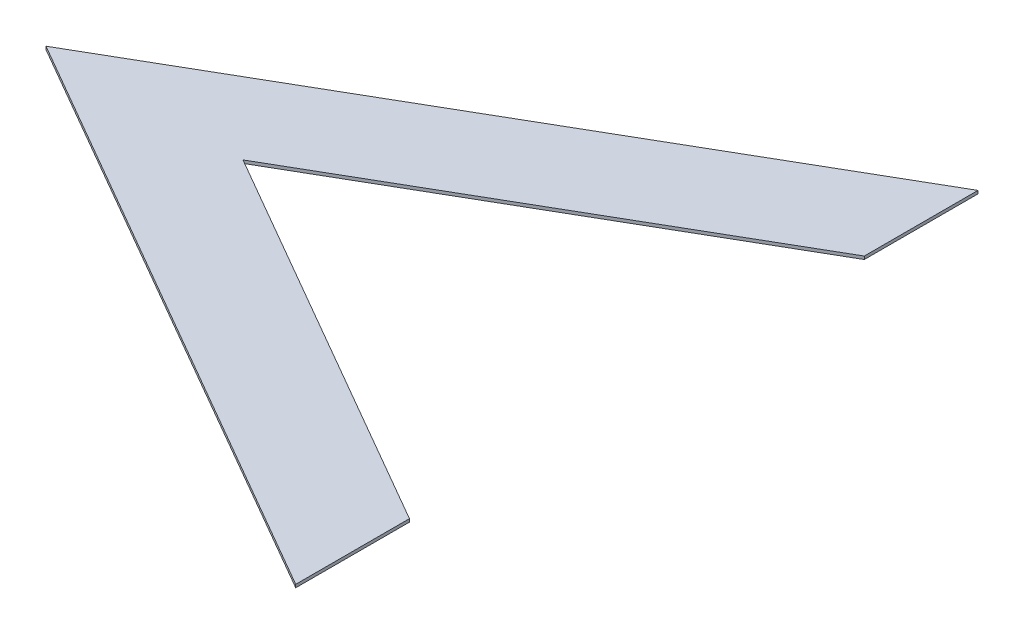
ISO-10303-21;
HEADER;
FILE_DESCRIPTION(('STEP AP214'),'2;1');
FILE_NAME('part.step','',(''),(''),'','','');
FILE_SCHEMA(('AUTOMOTIVE_DESIGN { 1 0 10303 214 1 1 1 1 }'));
ENDSEC;
DATA;
#1=APPLICATION_CONTEXT('core data for automotive mechanical design processes');
#2=APPLICATION_PROTOCOL_DEFINITION('international standard','automotive_design',2000,#1);
#3=PRODUCT_CONTEXT('',#1,'mechanical');
#4=PRODUCT('Part','Part','',(#3));
#5=PRODUCT_RELATED_PRODUCT_CATEGORY('part','',(#4));
#6=PRODUCT_DEFINITION_FORMATION('','',#4);
#7=PRODUCT_DEFINITION_CONTEXT('part definition',#1,'design');
#8=PRODUCT_DEFINITION('design','',#6,#7);
#9=PRODUCT_DEFINITION_SHAPE('','',#8);
#10=(LENGTH_UNIT() NAMED_UNIT(*) SI_UNIT(.MILLI.,.METRE.));
#11=(NAMED_UNIT(*) PLANE_ANGLE_UNIT() SI_UNIT($,.RADIAN.));
#12=(NAMED_UNIT(*) SI_UNIT($,.STERADIAN.) SOLID_ANGLE_UNIT());
#13=UNCERTAINTY_MEASURE_WITH_UNIT(LENGTH_MEASURE(1.E-05),#10,'distance_accuracy_value','');
#14=(GEOMETRIC_REPRESENTATION_CONTEXT(3) GLOBAL_UNCERTAINTY_ASSIGNED_CONTEXT((#13)) GLOBAL_UNIT_ASSIGNED_CONTEXT((#10,
#11,#12)) REPRESENTATION_CONTEXT('',''));
#15=CARTESIAN_POINT('',(0.,0.,0.));
#16=DIRECTION('',(0.,0.,1.));
#17=DIRECTION('',(1.,0.,0.));
#18=AXIS2_PLACEMENT_3D('',#15,#16,#17);
#19=CARTESIAN_POINT('',(34.5602065875376,71.3728759217129,85.6019747302543));
#20=DIRECTION('',(-1.,0.,0.));
#21=DIRECTION('',(0.,0.,1.));
#22=AXIS2_PLACEMENT_3D('',#19,#20,#21);
#23=PLANE('',#22);
#24=DIRECTION('',(0.,0.,-1.));
#25=VECTOR('',#24,1.);
#26=CARTESIAN_POINT('',(34.5602065875376,71.1228759217129,85.6019747302543));
#27=LINE('',#26,#25);
#28=CARTESIAN_POINT('',(34.5602065875376,71.1228759217129,85.6019747302543));
#29=VERTEX_POINT('',#28);
#30=CARTESIAN_POINT('',(34.5602065875376,71.122875921713,76.268641396921));
#31=VERTEX_POINT('',#30);
#32=EDGE_CURVE('E119',#29,#31,#27,.T.);
#33=ORIENTED_EDGE('',*,*,#32,.T.);
#34=DIRECTION('',(0.,-1.,0.));
#35=VECTOR('',#34,1.);
#36=CARTESIAN_POINT('',(34.5602065875376,71.372875921713,76.268641396921));
#37=LINE('',#36,#35);
#38=CARTESIAN_POINT('',(34.5602065875376,71.372875921713,76.268641396921));
#39=VERTEX_POINT('',#38);
#40=EDGE_CURVE('E11',#39,#31,#37,.T.);
#41=ORIENTED_EDGE('',*,*,#40,.F.);
#42=DIRECTION('',(0.,0.,-1.));
#43=VECTOR('',#42,1.);
#44=CARTESIAN_POINT('',(34.5602065875376,71.3728759217129,85.6019747302543));
#45=LINE('',#44,#43);
#46=CARTESIAN_POINT('',(34.5602065875376,71.3728759217129,85.6019747302543));
#47=VERTEX_POINT('',#46);
#48=EDGE_CURVE('E129',#47,#39,#45,.T.);
#49=ORIENTED_EDGE('',*,*,#48,.F.);
#50=DIRECTION('',(0.,-1.,0.));
#51=VECTOR('',#50,1.);
#52=CARTESIAN_POINT('',(34.5602065875376,71.3728759217129,85.6019747302543));
#53=LINE('',#52,#51);
#54=EDGE_CURVE('E115',#47,#29,#53,.T.);
#55=ORIENTED_EDGE('',*,*,#54,.T.);
#56=EDGE_LOOP('',(#33,#41,#49,#55));
#57=FACE_BOUND('',#56,.T.);
#58=ADVANCED_FACE('F35',(#57),#23,.F.);
#59=CARTESIAN_POINT('',(34.5602065875376,71.372875921713,76.268641396921));
#60=DIRECTION('',(0.5,0.,0.866025403784439));
#61=DIRECTION('',(0.866025403784439,0.,-0.5));
#62=AXIS2_PLACEMENT_3D('',#59,#60,#61);
#63=PLANE('',#62);
#64=DIRECTION('',(-0.866025403784439,0.,0.5));
#65=VECTOR('',#64,1.);
#66=CARTESIAN_POINT('',(34.5602065875376,71.122875921713,76.268641396921));
#67=LINE('',#66,#65);
#68=CARTESIAN_POINT('',(-13.9372160243909,71.1228759217127,104.268641396921));
#69=VERTEX_POINT('',#68);
#70=EDGE_CURVE('E122',#31,#69,#67,.T.);
#71=ORIENTED_EDGE('',*,*,#70,.T.);
#72=DIRECTION('',(0.,-1.,0.));
#73=VECTOR('',#72,1.);
#74=CARTESIAN_POINT('',(-13.9372160243909,71.3728759217127,104.268641396921));
#75=LINE('',#74,#73);
#76=CARTESIAN_POINT('',(-13.9372160243909,71.3728759217127,104.268641396921));
#77=VERTEX_POINT('',#76);
#78=EDGE_CURVE('E43',#77,#69,#75,.T.);
#79=ORIENTED_EDGE('',*,*,#78,.F.);
#80=DIRECTION('',(-0.866025403784439,0.,0.5));
#81=VECTOR('',#80,1.);
#82=CARTESIAN_POINT('',(34.5602065875376,71.372875921713,76.268641396921));
#83=LINE('',#82,#81);
#84=EDGE_CURVE('E88',#39,#77,#83,.T.);
#85=ORIENTED_EDGE('',*,*,#84,.F.);
#86=ORIENTED_EDGE('',*,*,#40,.T.);
#87=EDGE_LOOP('',(#71,#79,#85,#86));
#88=FACE_BOUND('',#87,.T.);
#89=ADVANCED_FACE('F153',(#88),#63,.F.);
#90=CARTESIAN_POINT('',(-13.9372160243909,71.3728759217127,104.268641396921));
#91=DIRECTION('',(0.5,0.,-0.866025403784438));
#92=DIRECTION('',(-0.866025403784439,0.,-0.5));
#93=AXIS2_PLACEMENT_3D('',#90,#91,#92);
#94=PLANE('',#93);
#95=DIRECTION('',(0.866025403784438,0.,0.5));
#96=VECTOR('',#95,1.);
#97=CARTESIAN_POINT('',(-13.9372160243909,71.1228759217127,104.268641396921));
#98=LINE('',#97,#96);
#99=CARTESIAN_POINT('',(34.5602065875376,71.1228759217125,132.268641396921));
#100=VERTEX_POINT('',#99);
#101=EDGE_CURVE('E124',#69,#100,#98,.T.);
#102=ORIENTED_EDGE('',*,*,#101,.T.);
#103=DIRECTION('',(0.,-1.,0.));
#104=VECTOR('',#103,1.);
#105=CARTESIAN_POINT('',(34.5602065875376,71.3728759217125,132.268641396921));
#106=LINE('',#105,#104);
#107=CARTESIAN_POINT('',(34.5602065875376,71.3728759217125,132.268641396921));
#108=VERTEX_POINT('',#107);
#109=EDGE_CURVE('E110',#108,#100,#106,.T.);
#110=ORIENTED_EDGE('',*,*,#109,.F.);
#111=DIRECTION('',(0.866025403784438,0.,0.5));
#112=VECTOR('',#111,1.);
#113=CARTESIAN_POINT('',(-13.9372160243909,71.3728759217127,104.268641396921));
#114=LINE('',#113,#112);
#115=EDGE_CURVE('E101',#77,#108,#114,.T.);
#116=ORIENTED_EDGE('',*,*,#115,.F.);
#117=ORIENTED_EDGE('',*,*,#78,.T.);
#118=EDGE_LOOP('',(#102,#110,#116,#117));
#119=FACE_BOUND('',#118,.T.);
#120=ADVANCED_FACE('F135',(#119),#94,.F.);
#121=CARTESIAN_POINT('',(34.5602065875376,71.3728759217125,132.268641396921));
#122=DIRECTION('',(-1.,0.,0.));
#123=DIRECTION('',(0.,0.,1.));
#124=AXIS2_PLACEMENT_3D('',#121,#122,#123);
#125=PLANE('',#124);
#126=DIRECTION('',(0.,0.,-1.));
#127=VECTOR('',#126,1.);
#128=CARTESIAN_POINT('',(34.5602065875376,71.1228759217125,132.268641396921));
#129=LINE('',#128,#127);
#130=CARTESIAN_POINT('',(34.5602065875376,71.1228759217125,122.935308063588));
#131=VERTEX_POINT('',#130);
#132=EDGE_CURVE('E109',#100,#131,#129,.T.);
#133=ORIENTED_EDGE('',*,*,#132,.T.);
#134=DIRECTION('',(0.,-1.,0.));
#135=VECTOR('',#134,1.);
#136=CARTESIAN_POINT('',(34.5602065875376,71.3728759217126,122.935308063588));
#137=LINE('',#136,#135);
#138=CARTESIAN_POINT('',(34.5602065875376,71.3728759217126,122.935308063588));
#139=VERTEX_POINT('',#138);
#140=EDGE_CURVE('E106',#139,#131,#137,.T.);
#141=ORIENTED_EDGE('',*,*,#140,.F.);
#142=DIRECTION('',(0.,0.,-1.));
#143=VECTOR('',#142,1.);
#144=CARTESIAN_POINT('',(34.5602065875376,71.3728759217125,132.268641396921));
#145=LINE('',#144,#143);
#146=EDGE_CURVE('E95',#108,#139,#145,.T.);
#147=ORIENTED_EDGE('',*,*,#146,.F.);
#148=ORIENTED_EDGE('',*,*,#109,.T.);
#149=EDGE_LOOP('',(#133,#141,#147,#148));
#150=FACE_BOUND('',#149,.T.);
#151=ADVANCED_FACE('F107',(#150),#125,.F.);
#152=CARTESIAN_POINT('',(34.5602065875376,71.3728759217126,122.935308063588));
#153=DIRECTION('',(-0.5,0.,0.866025403784439));
#154=DIRECTION('',(0.866025403784439,0.,0.5));
#155=AXIS2_PLACEMENT_3D('',#152,#153,#154);
#156=PLANE('',#155);
#157=DIRECTION('',(-0.866025403784439,0.,-0.5));
#158=VECTOR('',#157,1.);
#159=CARTESIAN_POINT('',(34.5602065875376,71.1228759217125,122.935308063588));
#160=LINE('',#159,#158);
#161=CARTESIAN_POINT('',(2.2285915129186,71.1228759217127,104.268641396921));
#162=VERTEX_POINT('',#161);
#163=EDGE_CURVE('E74',#131,#162,#160,.T.);
#164=ORIENTED_EDGE('',*,*,#163,.T.);
#165=DIRECTION('',(0.,-1.,0.));
#166=VECTOR('',#165,1.);
#167=CARTESIAN_POINT('',(2.2285915129186,71.3728759217127,104.268641396921));
#168=LINE('',#167,#166);
#169=CARTESIAN_POINT('',(2.2285915129186,71.3728759217127,104.268641396921));
#170=VERTEX_POINT('',#169);
#171=EDGE_CURVE('E111',#170,#162,#168,.T.);
#172=ORIENTED_EDGE('',*,*,#171,.F.);
#173=DIRECTION('',(-0.866025403784439,0.,-0.5));
#174=VECTOR('',#173,1.);
#175=CARTESIAN_POINT('',(34.5602065875376,71.3728759217126,122.935308063588));
#176=LINE('',#175,#174);
#177=EDGE_CURVE('E99',#139,#170,#176,.T.);
#178=ORIENTED_EDGE('',*,*,#177,.F.);
#179=ORIENTED_EDGE('',*,*,#140,.T.);
#180=EDGE_LOOP('',(#164,#172,#178,#179));
#181=FACE_BOUND('',#180,.T.);
#182=ADVANCED_FACE('F113',(#181),#156,.F.);
#183=CARTESIAN_POINT('',(2.2285915129186,71.3728759217127,104.268641396921));
#184=DIRECTION('',(-0.5,0.,-0.866025403784439));
#185=DIRECTION('',(-0.866025403784439,0.,0.5));
#186=AXIS2_PLACEMENT_3D('',#183,#184,#185);
#187=PLANE('',#186);
#188=DIRECTION('',(0.866025403784439,0.,-0.5));
#189=VECTOR('',#188,1.);
#190=CARTESIAN_POINT('',(2.2285915129186,71.1228759217127,104.268641396921));
#191=LINE('',#190,#189);
#192=EDGE_CURVE('E80',#162,#29,#191,.T.);
#193=ORIENTED_EDGE('',*,*,#192,.T.);
#194=ORIENTED_EDGE('',*,*,#54,.F.);
#195=DIRECTION('',(0.866025403784439,0.,-0.5));
#196=VECTOR('',#195,1.);
#197=CARTESIAN_POINT('',(2.2285915129186,71.3728759217127,104.268641396921));
#198=LINE('',#197,#196);
#199=EDGE_CURVE('E51',#170,#47,#198,.T.);
#200=ORIENTED_EDGE('',*,*,#199,.F.);
#201=ORIENTED_EDGE('',*,*,#171,.T.);
#202=EDGE_LOOP('',(#193,#194,#200,#201));
#203=FACE_BOUND('',#202,.T.);
#204=ADVANCED_FACE('F142',(#203),#187,.F.);
#205=CARTESIAN_POINT('',(0.,71.3728759217138,7.42889746246427E-13));
#206=DIRECTION('',(0.,1.,0.));
#207=DIRECTION('',(0.,0.,1.));
#208=AXIS2_PLACEMENT_3D('',#205,#206,#207);
#209=PLANE('',#208);
#210=ORIENTED_EDGE('',*,*,#48,.T.);
#211=ORIENTED_EDGE('',*,*,#84,.T.);
#212=ORIENTED_EDGE('',*,*,#115,.T.);
#213=ORIENTED_EDGE('',*,*,#146,.T.);
#214=ORIENTED_EDGE('',*,*,#177,.T.);
#215=ORIENTED_EDGE('',*,*,#199,.T.);
#216=EDGE_LOOP('',(#210,#211,#212,#213,#214,#215));
#217=FACE_BOUND('',#216,.T.);
#218=ADVANCED_FACE('F97',(#217),#209,.T.);
#219=CARTESIAN_POINT('',(0.,71.1228759217138,7.40271135242295E-13));
#220=DIRECTION('',(0.,1.,0.));
#221=DIRECTION('',(0.,0.,1.));
#222=AXIS2_PLACEMENT_3D('',#219,#220,#221);
#223=PLANE('',#222);
#224=ORIENTED_EDGE('',*,*,#32,.F.);
#225=ORIENTED_EDGE('',*,*,#192,.F.);
#226=ORIENTED_EDGE('',*,*,#163,.F.);
#227=ORIENTED_EDGE('',*,*,#132,.F.);
#228=ORIENTED_EDGE('',*,*,#101,.F.);
#229=ORIENTED_EDGE('',*,*,#70,.F.);
#230=EDGE_LOOP('',(#224,#225,#226,#227,#228,#229));
#231=FACE_BOUND('',#230,.T.);
#232=ADVANCED_FACE('F138',(#231),#223,.F.);
#233=CLOSED_SHELL('',(#58,#89,#120,#151,#182,#204,#218,#232));
#234=MANIFOLD_SOLID_BREP('B2',#233);
#235=ADVANCED_BREP_SHAPE_REPRESENTATION('',(#18,#234),#14);
#236=SHAPE_DEFINITION_REPRESENTATION(#9,#235);
ENDSEC;
END-ISO-10303-21;
